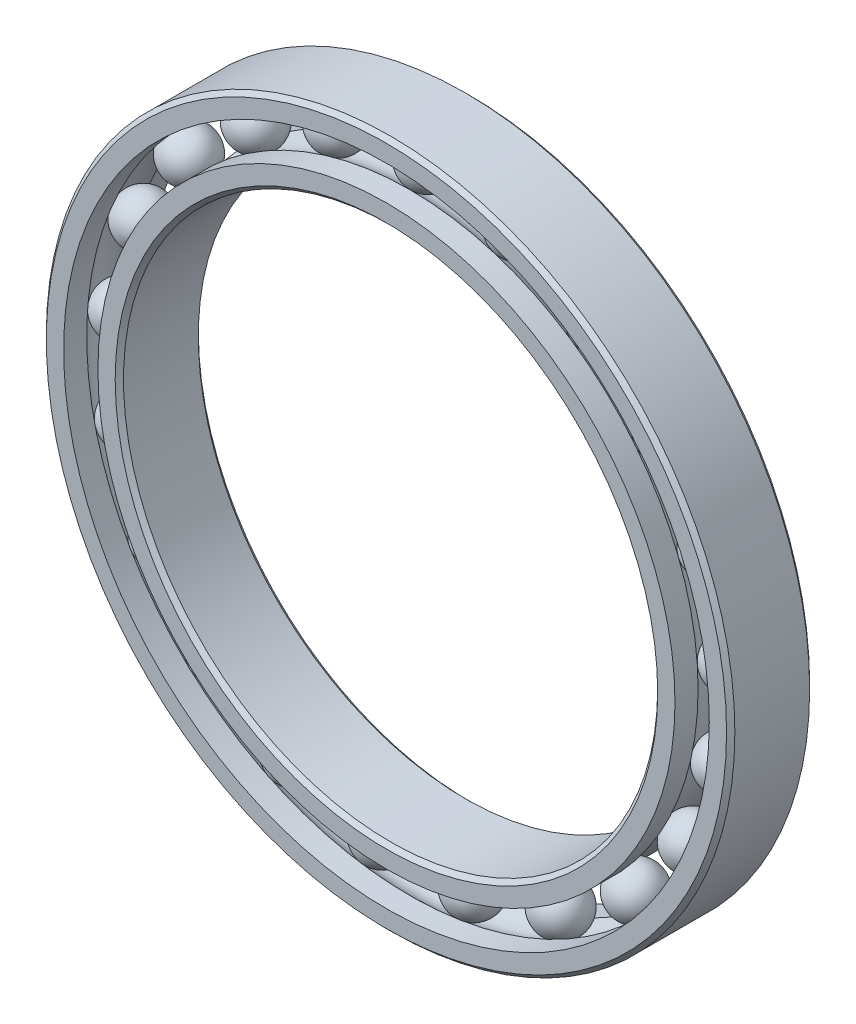
ISO-10303-21;
HEADER;
FILE_DESCRIPTION(('STEP AP214'),'2;1');
FILE_NAME('part.step','',(''),(''),'','','');
FILE_SCHEMA(('AUTOMOTIVE_DESIGN { 1 0 10303 214 1 1 1 1 }'));
ENDSEC;
DATA;
#1=APPLICATION_CONTEXT('core data for automotive mechanical design processes');
#2=APPLICATION_PROTOCOL_DEFINITION('international standard','automotive_design',2000,#1);
#3=PRODUCT_CONTEXT('',#1,'mechanical');
#4=PRODUCT('Part','Part','',(#3));
#5=PRODUCT_RELATED_PRODUCT_CATEGORY('part','',(#4));
#6=PRODUCT_DEFINITION_FORMATION('','',#4);
#7=PRODUCT_DEFINITION_CONTEXT('part definition',#1,'design');
#8=PRODUCT_DEFINITION('design','',#6,#7);
#9=PRODUCT_DEFINITION_SHAPE('','',#8);
#10=(LENGTH_UNIT() NAMED_UNIT(*) SI_UNIT(.MILLI.,.METRE.));
#11=(NAMED_UNIT(*) PLANE_ANGLE_UNIT() SI_UNIT($,.RADIAN.));
#12=(NAMED_UNIT(*) SI_UNIT($,.STERADIAN.) SOLID_ANGLE_UNIT());
#13=UNCERTAINTY_MEASURE_WITH_UNIT(LENGTH_MEASURE(1.E-05),#10,'distance_accuracy_value','');
#14=(GEOMETRIC_REPRESENTATION_CONTEXT(3) GLOBAL_UNCERTAINTY_ASSIGNED_CONTEXT((#13)) GLOBAL_UNIT_ASSIGNED_CONTEXT((#10,
#11,#12)) REPRESENTATION_CONTEXT('',''));
#15=CARTESIAN_POINT('',(0.,0.,0.));
#16=DIRECTION('',(0.,0.,1.));
#17=DIRECTION('',(1.,0.,0.));
#18=AXIS2_PLACEMENT_3D('',#15,#16,#17);
#19=CARTESIAN_POINT('',(7.58994574108045,24.6059997489932,0.));
#20=DIRECTION('',(0.,0.,1.));
#21=DIRECTION('',(0.294755174410891,0.955572805786145,0.));
#22=AXIS2_PLACEMENT_3D('',#19,#20,#21);
#23=SPHERICAL_SURFACE('',#22,2.12277479717142);
#24=CARTESIAN_POINT('',(7.58994574108045,24.6059997489932,2.12277479717142));
#25=VERTEX_POINT('',#24);
#26=VERTEX_LOOP('',#25);
#27=FACE_BOUND('',#26,.T.);
#28=ADVANCED_FACE('F37',(#27),#23,.T.);
#29=CLOSED_SHELL('',(#28));
#30=MANIFOLD_SOLID_BREP('B2',#29);
#31=CARTESIAN_POINT('',(14.505491495138,21.2756484386371,0.));
#32=DIRECTION('',(0.,0.,1.));
#33=DIRECTION('',(0.563320058063612,0.826238774316002,0.));
#34=AXIS2_PLACEMENT_3D('',#31,#32,#33);
#35=SPHERICAL_SURFACE('',#34,2.12277479717142);
#36=CARTESIAN_POINT('',(14.505491495138,21.2756484386371,2.12277479717142));
#37=VERTEX_POINT('',#36);
#38=VERTEX_LOOP('',#37);
#39=FACE_BOUND('',#38,.T.);
#40=ADVANCED_FACE('F55',(#39),#35,.T.);
#41=CLOSED_SHELL('',(#40));
#42=MANIFOLD_SOLID_BREP('B6',#41);
#43=CARTESIAN_POINT('',(20.1321606735516,16.0548623978626,0.));
#44=DIRECTION('',(0.,0.,1.));
#45=DIRECTION('',(0.781831482468022,0.623489801858743,0.));
#46=AXIS2_PLACEMENT_3D('',#43,#44,#45);
#47=SPHERICAL_SURFACE('',#46,2.12277479717142);
#48=CARTESIAN_POINT('',(20.1321606735516,16.0548623978626,2.12277479717142));
#49=VERTEX_POINT('',#48);
#50=VERTEX_LOOP('',#49);
#51=FACE_BOUND('',#50,.T.);
#52=ADVANCED_FACE('F73',(#51),#47,.T.);
#53=CLOSED_SHELL('',(#52));
#54=MANIFOLD_SOLID_BREP('B33',#53);
#55=CARTESIAN_POINT('',(23.9699990275882,9.40753137743494,0.));
#56=DIRECTION('',(0.,0.,1.));
#57=DIRECTION('',(0.9308737486442,0.365341024366405,0.));
#58=AXIS2_PLACEMENT_3D('',#55,#56,#57);
#59=SPHERICAL_SURFACE('',#58,2.12277479717142);
#60=CARTESIAN_POINT('',(23.9699990275882,9.40753137743494,2.12277479717142));
#61=VERTEX_POINT('',#60);
#62=VERTEX_LOOP('',#61);
#63=FACE_BOUND('',#62,.T.);
#64=ADVANCED_FACE('F91',(#63),#59,.T.);
#65=CLOSED_SHELL('',(#64));
#66=MANIFOLD_SOLID_BREP('B51',#65);
#67=CARTESIAN_POINT('',(25.6779977774154,1.9242999098507,0.));
#68=DIRECTION('',(0.,0.,1.));
#69=DIRECTION('',(0.997203797181179,0.074730093586435,0.));
#70=AXIS2_PLACEMENT_3D('',#67,#68,#69);
#71=SPHERICAL_SURFACE('',#70,2.12277479717142);
#72=CARTESIAN_POINT('',(25.6779977774154,1.9242999098507,2.12277479717142));
#73=VERTEX_POINT('',#72);
#74=VERTEX_LOOP('',#73);
#75=FACE_BOUND('',#74,.T.);
#76=ADVANCED_FACE('F111',(#75),#71,.T.);
#77=CLOSED_SHELL('',(#76));
#78=MANIFOLD_SOLID_BREP('B69',#77);
#79=CARTESIAN_POINT('',(25.104393738682,-5.72991404937483,0.));
#80=DIRECTION('',(0.,0.,1.));
#81=DIRECTION('',(0.974927912181826,-0.222520933956304,0.));
#82=AXIS2_PLACEMENT_3D('',#79,#80,#81);
#83=SPHERICAL_SURFACE('',#82,2.12277479717142);
#84=CARTESIAN_POINT('',(25.104393738682,-5.72991404937483,2.12277479717142));
#85=VERTEX_POINT('',#84);
#86=VERTEX_LOOP('',#85);
#87=FACE_BOUND('',#86,.T.);
#88=ADVANCED_FACE('F131',(#87),#83,.T.);
#89=CLOSED_SHELL('',(#88));
#90=MANIFOLD_SOLID_BREP('B87',#89);
#91=CARTESIAN_POINT('',(22.3001541474494,-12.8749999999998,0.));
#92=DIRECTION('',(0.,0.,1.));
#93=DIRECTION('',(0.866025403784443,-0.499999999999992,0.));
#94=AXIS2_PLACEMENT_3D('',#91,#92,#93);
#95=SPHERICAL_SURFACE('',#94,2.12277479717142);
#96=CARTESIAN_POINT('',(22.3001541474494,-12.8749999999998,2.12277479717142));
#97=VERTEX_POINT('',#96);
#98=VERTEX_LOOP('',#97);
#99=FACE_BOUND('',#98,.T.);
#100=ADVANCED_FACE('F151',(#99),#95,.T.);
#101=CLOSED_SHELL('',(#100));
#102=MANIFOLD_SOLID_BREP('B107',#101);
#103=CARTESIAN_POINT('',(17.5144479976013,-18.8760856996179,0.));
#104=DIRECTION('',(0.,0.,1.));
#105=DIRECTION('',(0.680172737770926,-0.73305187182982,0.));
#106=AXIS2_PLACEMENT_3D('',#103,#104,#105);
#107=SPHERICAL_SURFACE('',#106,2.12277479717142);
#108=CARTESIAN_POINT('',(17.5144479976013,-18.8760856996179,2.12277479717142));
#109=VERTEX_POINT('',#108);
#110=VERTEX_LOOP('',#109);
#111=FACE_BOUND('',#110,.T.);
#112=ADVANCED_FACE('F171',(#111),#107,.T.);
#113=CLOSED_SHELL('',(#112));
#114=MANIFOLD_SOLID_BREP('B127',#113);
#115=CARTESIAN_POINT('',(11.1725062822773,-23.1999483484872,0.));
#116=DIRECTION('',(0.,0.,1.));
#117=DIRECTION('',(0.433883739117565,-0.900968867902416,0.));
#118=AXIS2_PLACEMENT_3D('',#115,#116,#117);
#119=SPHERICAL_SURFACE('',#118,2.12277479717142);
#120=CARTESIAN_POINT('',(11.1725062822773,-23.1999483484872,2.12277479717142));
#121=VERTEX_POINT('',#120);
#122=VERTEX_LOOP('',#121);
#123=FACE_BOUND('',#122,.T.);
#124=ADVANCED_FACE('F191',(#123),#119,.T.);
#125=CLOSED_SHELL('',(#124));
#126=MANIFOLD_SOLID_BREP('B147',#125);
#127=CARTESIAN_POINT('',(3.83783835403668,-25.462393775297,0.));
#128=DIRECTION('',(0.,0.,1.));
#129=DIRECTION('',(0.149042266176182,-0.988830826225127,0.));
#130=AXIS2_PLACEMENT_3D('',#127,#128,#129);
#131=SPHERICAL_SURFACE('',#130,2.12277479717142);
#132=CARTESIAN_POINT('',(3.83783835403668,-25.462393775297,2.12277479717142));
#133=VERTEX_POINT('',#132);
#134=VERTEX_LOOP('',#133);
#135=FACE_BOUND('',#134,.T.);
#136=ADVANCED_FACE('F211',(#135),#131,.T.);
#137=CLOSED_SHELL('',(#136));
#138=MANIFOLD_SOLID_BREP('B167',#137);
#139=CARTESIAN_POINT('',(-3.83783835403632,-25.4623937752971,0.));
#140=DIRECTION('',(0.,0.,1.));
#141=DIRECTION('',(-0.149042266176168,-0.98883082622513,0.));
#142=AXIS2_PLACEMENT_3D('',#139,#140,#141);
#143=SPHERICAL_SURFACE('',#142,2.12277479717142);
#144=CARTESIAN_POINT('',(-3.83783835403632,-25.4623937752971,2.12277479717142));
#145=VERTEX_POINT('',#144);
#146=VERTEX_LOOP('',#145);
#147=FACE_BOUND('',#146,.T.);
#148=ADVANCED_FACE('F231',(#147),#143,.T.);
#149=CLOSED_SHELL('',(#148));
#150=MANIFOLD_SOLID_BREP('B187',#149);
#151=CARTESIAN_POINT('',(-11.172506282277,-23.1999483484874,0.));
#152=DIRECTION('',(0.,0.,1.));
#153=DIRECTION('',(-0.433883739117553,-0.900968867902422,0.));
#154=AXIS2_PLACEMENT_3D('',#151,#152,#153);
#155=SPHERICAL_SURFACE('',#154,2.12277479717142);
#156=CARTESIAN_POINT('',(-11.172506282277,-23.1999483484874,2.12277479717142));
#157=VERTEX_POINT('',#156);
#158=VERTEX_LOOP('',#157);
#159=FACE_BOUND('',#158,.T.);
#160=ADVANCED_FACE('F251',(#159),#155,.T.);
#161=CLOSED_SHELL('',(#160));
#162=MANIFOLD_SOLID_BREP('B207',#161);
#163=CARTESIAN_POINT('',(-17.5144479976011,-18.8760856996181,0.));
#164=DIRECTION('',(0.,0.,1.));
#165=DIRECTION('',(-0.680172737770915,-0.73305187182983,0.));
#166=AXIS2_PLACEMENT_3D('',#163,#164,#165);
#167=SPHERICAL_SURFACE('',#166,2.12277479717142);
#168=CARTESIAN_POINT('',(-17.5144479976011,-18.8760856996181,2.12277479717142));
#169=VERTEX_POINT('',#168);
#170=VERTEX_LOOP('',#169);
#171=FACE_BOUND('',#170,.T.);
#172=ADVANCED_FACE('F271',(#171),#167,.T.);
#173=CLOSED_SHELL('',(#172));
#174=MANIFOLD_SOLID_BREP('B227',#173);
#175=CARTESIAN_POINT('',(-22.3001541474492,-12.8750000000001,0.));
#176=DIRECTION('',(0.,0.,1.));
#177=DIRECTION('',(-0.866025403784436,-0.500000000000004,0.));
#178=AXIS2_PLACEMENT_3D('',#175,#176,#177);
#179=SPHERICAL_SURFACE('',#178,2.12277479717142);
#180=CARTESIAN_POINT('',(-22.3001541474492,-12.8750000000001,2.12277479717142));
#181=VERTEX_POINT('',#180);
#182=VERTEX_LOOP('',#181);
#183=FACE_BOUND('',#182,.T.);
#184=ADVANCED_FACE('F291',(#183),#179,.T.);
#185=CLOSED_SHELL('',(#184));
#186=MANIFOLD_SOLID_BREP('B247',#185);
#187=CARTESIAN_POINT('',(-25.1043937386819,-5.72991404937519,0.));
#188=DIRECTION('',(0.,0.,1.));
#189=DIRECTION('',(-0.974927912181823,-0.222520933956318,0.));
#190=AXIS2_PLACEMENT_3D('',#187,#188,#189);
#191=SPHERICAL_SURFACE('',#190,2.12277479717142);
#192=CARTESIAN_POINT('',(-25.1043937386819,-5.72991404937519,2.12277479717142));
#193=VERTEX_POINT('',#192);
#194=VERTEX_LOOP('',#193);
#195=FACE_BOUND('',#194,.T.);
#196=ADVANCED_FACE('F311',(#195),#191,.T.);
#197=CLOSED_SHELL('',(#196));
#198=MANIFOLD_SOLID_BREP('B267',#197);
#199=CARTESIAN_POINT('',(-25.6779977774154,1.92429990985034,0.));
#200=DIRECTION('',(0.,0.,1.));
#201=DIRECTION('',(-0.997203797181181,0.0747300935864209,0.));
#202=AXIS2_PLACEMENT_3D('',#199,#200,#201);
#203=SPHERICAL_SURFACE('',#202,2.12277479717142);
#204=CARTESIAN_POINT('',(-25.6779977774154,1.92429990985034,2.12277479717142));
#205=VERTEX_POINT('',#204);
#206=VERTEX_LOOP('',#205);
#207=FACE_BOUND('',#206,.T.);
#208=ADVANCED_FACE('F331',(#207),#203,.T.);
#209=CLOSED_SHELL('',(#208));
#210=MANIFOLD_SOLID_BREP('B287',#209);
#211=CARTESIAN_POINT('',(-23.9699990275883,9.40753137743461,0.));
#212=DIRECTION('',(0.,0.,1.));
#213=DIRECTION('',(-0.930873748644205,0.365341024366392,0.));
#214=AXIS2_PLACEMENT_3D('',#211,#212,#213);
#215=SPHERICAL_SURFACE('',#214,2.12277479717142);
#216=CARTESIAN_POINT('',(-23.9699990275883,9.40753137743461,2.12277479717142));
#217=VERTEX_POINT('',#216);
#218=VERTEX_LOOP('',#217);
#219=FACE_BOUND('',#218,.T.);
#220=ADVANCED_FACE('F351',(#219),#215,.T.);
#221=CLOSED_SHELL('',(#220));
#222=MANIFOLD_SOLID_BREP('B307',#221);
#223=CARTESIAN_POINT('',(-20.1321606735518,16.0548623978624,0.));
#224=DIRECTION('',(0.,0.,1.));
#225=DIRECTION('',(-0.781831482468031,0.623489801858732,0.));
#226=AXIS2_PLACEMENT_3D('',#223,#224,#225);
#227=SPHERICAL_SURFACE('',#226,2.12277479717142);
#228=CARTESIAN_POINT('',(-20.1321606735518,16.0548623978624,2.12277479717142));
#229=VERTEX_POINT('',#228);
#230=VERTEX_LOOP('',#229);
#231=FACE_BOUND('',#230,.T.);
#232=ADVANCED_FACE('F371',(#231),#227,.T.);
#233=CLOSED_SHELL('',(#232));
#234=MANIFOLD_SOLID_BREP('B327',#233);
#235=CARTESIAN_POINT('',(-14.5054914951383,21.2756484386368,0.));
#236=DIRECTION('',(0.,0.,1.));
#237=DIRECTION('',(-0.563320058063623,0.826238774315994,0.));
#238=AXIS2_PLACEMENT_3D('',#235,#236,#237);
#239=SPHERICAL_SURFACE('',#238,2.12277479717142);
#240=CARTESIAN_POINT('',(-14.5054914951383,21.2756484386368,2.12277479717142));
#241=VERTEX_POINT('',#240);
#242=VERTEX_LOOP('',#241);
#243=FACE_BOUND('',#242,.T.);
#244=ADVANCED_FACE('F391',(#243),#239,.T.);
#245=CLOSED_SHELL('',(#244));
#246=MANIFOLD_SOLID_BREP('B347',#245);
#247=CARTESIAN_POINT('',(-7.5899457410808,24.6059997489931,0.));
#248=DIRECTION('',(0.,0.,1.));
#249=DIRECTION('',(-0.294755174410905,0.955572805786141,0.));
#250=AXIS2_PLACEMENT_3D('',#247,#248,#249);
#251=SPHERICAL_SURFACE('',#250,2.12277479717142);
#252=CARTESIAN_POINT('',(-7.5899457410808,24.6059997489931,2.12277479717142));
#253=VERTEX_POINT('',#252);
#254=VERTEX_LOOP('',#253);
#255=FACE_BOUND('',#254,.T.);
#256=ADVANCED_FACE('F411',(#255),#251,.T.);
#257=CLOSED_SHELL('',(#256));
#258=MANIFOLD_SOLID_BREP('B367',#257);
#259=CARTESIAN_POINT('',(0.,25.75,0.));
#260=DIRECTION('',(0.,0.,1.));
#261=DIRECTION('',(0.,1.,0.));
#262=AXIS2_PLACEMENT_3D('',#259,#260,#261);
#263=SPHERICAL_SURFACE('',#262,2.12277479717142);
#264=CARTESIAN_POINT('',(0.,25.75,2.12277479717142));
#265=VERTEX_POINT('',#264);
#266=VERTEX_LOOP('',#265);
#267=FACE_BOUND('',#266,.T.);
#268=ADVANCED_FACE('F433',(#267),#263,.T.);
#269=CLOSED_SHELL('',(#268));
#270=MANIFOLD_SOLID_BREP('B387',#269);
#271=CARTESIAN_POINT('',(0.,24.3055555555556,3.5));
#272=DIRECTION('',(0.,0.,-1.));
#273=DIRECTION('',(-1.,0.,0.));
#274=AXIS2_PLACEMENT_3D('',#271,#272,#273);
#275=PLANE('',#274);
#276=CARTESIAN_POINT('',(0.,0.,3.5));
#277=DIRECTION('',(0.,0.,1.));
#278=DIRECTION('',(1.,0.,0.));
#279=AXIS2_PLACEMENT_3D('',#276,#277,#278);
#280=CIRCLE('',#279,22.85);
#281=CARTESIAN_POINT('',(22.85,0.,3.5));
#282=VERTEX_POINT('',#281);
#283=EDGE_CURVE('E480',#282,#282,#280,.T.);
#284=ORIENTED_EDGE('',*,*,#283,.F.);
#285=EDGE_LOOP('',(#284));
#286=FACE_BOUND('',#285,.T.);
#287=CARTESIAN_POINT('',(0.,0.,3.5));
#288=DIRECTION('',(0.,0.,1.));
#289=DIRECTION('',(1.,0.,0.));
#290=AXIS2_PLACEMENT_3D('',#287,#288,#289);
#291=CIRCLE('',#290,24.3055555555556);
#292=CARTESIAN_POINT('',(24.3055555555556,0.,3.5));
#293=VERTEX_POINT('',#292);
#294=EDGE_CURVE('E432',#293,#293,#291,.T.);
#295=ORIENTED_EDGE('',*,*,#294,.T.);
#296=EDGE_LOOP('',(#295));
#297=FACE_BOUND('',#296,.T.);
#298=ADVANCED_FACE('F452',(#286,#297),#275,.F.);
#299=CARTESIAN_POINT('',(0.,0.,3.5));
#300=DIRECTION('',(0.,0.,1.));
#301=DIRECTION('',(1.,0.,0.));
#302=AXIS2_PLACEMENT_3D('',#299,#300,#301);
#303=CYLINDRICAL_SURFACE('',#302,24.3055555555556);
#304=ORIENTED_EDGE('',*,*,#294,.F.);
#305=EDGE_LOOP('',(#304));
#306=FACE_BOUND('',#305,.T.);
#307=CARTESIAN_POINT('',(0.,0.,1.55555555555556));
#308=DIRECTION('',(0.,0.,1.));
#309=DIRECTION('',(1.,0.,0.));
#310=AXIS2_PLACEMENT_3D('',#307,#308,#309);
#311=CIRCLE('',#310,24.3055555555556);
#312=CARTESIAN_POINT('',(24.3055555555556,0.,1.55555555555556));
#313=VERTEX_POINT('',#312);
#314=EDGE_CURVE('E458',#313,#313,#311,.T.);
#315=ORIENTED_EDGE('',*,*,#314,.T.);
#316=EDGE_LOOP('',(#315));
#317=FACE_BOUND('',#316,.T.);
#318=ADVANCED_FACE('F487',(#306,#317),#303,.T.);
#319=CARTESIAN_POINT('',(0.,0.,0.));
#320=DIRECTION('',(0.,0.,1.));
#321=DIRECTION('',(1.,0.,0.));
#322=AXIS2_PLACEMENT_3D('',#319,#320,#321);
#323=TOROIDAL_SURFACE('',#322,25.75,2.12277479717142);
#324=ORIENTED_EDGE('',*,*,#314,.F.);
#325=EDGE_LOOP('',(#324));
#326=FACE_BOUND('',#325,.T.);
#327=CARTESIAN_POINT('',(0.,0.,-1.55555555555556));
#328=DIRECTION('',(0.,0.,1.));
#329=DIRECTION('',(1.,0.,0.));
#330=AXIS2_PLACEMENT_3D('',#327,#328,#329);
#331=CIRCLE('',#330,24.3055555555556);
#332=CARTESIAN_POINT('',(24.3055555555556,0.,-1.55555555555556));
#333=VERTEX_POINT('',#332);
#334=EDGE_CURVE('E462',#333,#333,#331,.T.);
#335=ORIENTED_EDGE('',*,*,#334,.T.);
#336=EDGE_LOOP('',(#335));
#337=FACE_BOUND('',#336,.T.);
#338=ADVANCED_FACE('F491',(#326,#337),#323,.F.);
#339=CARTESIAN_POINT('',(0.,0.,3.5));
#340=DIRECTION('',(0.,0.,1.));
#341=DIRECTION('',(1.,0.,0.));
#342=AXIS2_PLACEMENT_3D('',#339,#340,#341);
#343=CYLINDRICAL_SURFACE('',#342,24.3055555555556);
#344=ORIENTED_EDGE('',*,*,#334,.F.);
#345=EDGE_LOOP('',(#344));
#346=FACE_BOUND('',#345,.T.);
#347=CARTESIAN_POINT('',(0.,0.,-3.5));
#348=DIRECTION('',(0.,0.,1.));
#349=DIRECTION('',(1.,0.,0.));
#350=AXIS2_PLACEMENT_3D('',#347,#348,#349);
#351=CIRCLE('',#350,24.3055555555556);
#352=CARTESIAN_POINT('',(24.3055555555556,0.,-3.5));
#353=VERTEX_POINT('',#352);
#354=EDGE_CURVE('E466',#353,#353,#351,.T.);
#355=ORIENTED_EDGE('',*,*,#354,.T.);
#356=EDGE_LOOP('',(#355));
#357=FACE_BOUND('',#356,.T.);
#358=ADVANCED_FACE('F496',(#346,#357),#343,.T.);
#359=CARTESIAN_POINT('',(0.,22.85,-3.5));
#360=DIRECTION('',(0.,0.,1.));
#361=DIRECTION('',(1.,0.,0.));
#362=AXIS2_PLACEMENT_3D('',#359,#360,#361);
#363=PLANE('',#362);
#364=ORIENTED_EDGE('',*,*,#354,.F.);
#365=EDGE_LOOP('',(#364));
#366=FACE_BOUND('',#365,.T.);
#367=CARTESIAN_POINT('',(0.,0.,-3.5));
#368=DIRECTION('',(0.,0.,1.));
#369=DIRECTION('',(1.,0.,0.));
#370=AXIS2_PLACEMENT_3D('',#367,#368,#369);
#371=CIRCLE('',#370,22.85);
#372=CARTESIAN_POINT('',(22.85,0.,-3.5));
#373=VERTEX_POINT('',#372);
#374=EDGE_CURVE('E471',#373,#373,#371,.T.);
#375=ORIENTED_EDGE('',*,*,#374,.T.);
#376=EDGE_LOOP('',(#375));
#377=FACE_BOUND('',#376,.T.);
#378=ADVANCED_FACE('F502',(#366,#377),#363,.F.);
#379=CARTESIAN_POINT('',(0.,0.,-3.15));
#380=DIRECTION('',(0.,0.,-1.));
#381=DIRECTION('',(-1.,0.,0.));
#382=AXIS2_PLACEMENT_3D('',#379,#380,#381);
#383=CONICAL_SURFACE('',#382,22.5,0.785398163397446);
#384=ORIENTED_EDGE('',*,*,#374,.F.);
#385=EDGE_LOOP('',(#384));
#386=FACE_BOUND('',#385,.T.);
#387=CARTESIAN_POINT('',(0.,0.,-3.15));
#388=DIRECTION('',(0.,0.,1.));
#389=DIRECTION('',(1.,0.,0.));
#390=AXIS2_PLACEMENT_3D('',#387,#388,#389);
#391=CIRCLE('',#390,22.5);
#392=CARTESIAN_POINT('',(22.5,0.,-3.15));
#393=VERTEX_POINT('',#392);
#394=EDGE_CURVE('E474',#393,#393,#391,.T.);
#395=ORIENTED_EDGE('',*,*,#394,.T.);
#396=EDGE_LOOP('',(#395));
#397=FACE_BOUND('',#396,.T.);
#398=ADVANCED_FACE('F506',(#386,#397),#383,.F.);
#399=CARTESIAN_POINT('',(0.,0.,3.5));
#400=DIRECTION('',(0.,0.,1.));
#401=DIRECTION('',(1.,0.,0.));
#402=AXIS2_PLACEMENT_3D('',#399,#400,#401);
#403=CYLINDRICAL_SURFACE('',#402,22.5);
#404=ORIENTED_EDGE('',*,*,#394,.F.);
#405=EDGE_LOOP('',(#404));
#406=FACE_BOUND('',#405,.T.);
#407=CARTESIAN_POINT('',(0.,0.,3.15));
#408=DIRECTION('',(0.,0.,1.));
#409=DIRECTION('',(1.,0.,0.));
#410=AXIS2_PLACEMENT_3D('',#407,#408,#409);
#411=CIRCLE('',#410,22.5);
#412=CARTESIAN_POINT('',(22.5,0.,3.15));
#413=VERTEX_POINT('',#412);
#414=EDGE_CURVE('E477',#413,#413,#411,.T.);
#415=ORIENTED_EDGE('',*,*,#414,.T.);
#416=EDGE_LOOP('',(#415));
#417=FACE_BOUND('',#416,.T.);
#418=ADVANCED_FACE('F510',(#406,#417),#403,.F.);
#419=CARTESIAN_POINT('',(0.,0.,3.5));
#420=DIRECTION('',(0.,0.,1.));
#421=DIRECTION('',(1.,0.,0.));
#422=AXIS2_PLACEMENT_3D('',#419,#420,#421);
#423=CONICAL_SURFACE('',#422,22.85,0.785398163397449);
#424=ORIENTED_EDGE('',*,*,#414,.F.);
#425=EDGE_LOOP('',(#424));
#426=FACE_BOUND('',#425,.T.);
#427=ORIENTED_EDGE('',*,*,#283,.T.);
#428=EDGE_LOOP('',(#427));
#429=FACE_BOUND('',#428,.T.);
#430=ADVANCED_FACE('F484',(#426,#429),#423,.F.);
#431=CLOSED_SHELL('',(#298,#318,#338,#358,#378,#398,#418,#430));
#432=MANIFOLD_SOLID_BREP('B407',#431);
#433=CARTESIAN_POINT('',(0.,0.,3.15));
#434=DIRECTION('',(0.,0.,-1.));
#435=DIRECTION('',(-1.,0.,0.));
#436=AXIS2_PLACEMENT_3D('',#433,#434,#435);
#437=CONICAL_SURFACE('',#436,29.,0.785398163397445);
#438=CARTESIAN_POINT('',(0.,0.,3.5));
#439=DIRECTION('',(0.,0.,1.));
#440=DIRECTION('',(1.,0.,0.));
#441=AXIS2_PLACEMENT_3D('',#438,#439,#440);
#442=CIRCLE('',#441,28.65);
#443=CARTESIAN_POINT('',(28.65,0.,3.5));
#444=VERTEX_POINT('',#443);
#445=EDGE_CURVE('E601',#444,#444,#442,.T.);
#446=ORIENTED_EDGE('',*,*,#445,.F.);
#447=EDGE_LOOP('',(#446));
#448=FACE_BOUND('',#447,.T.);
#449=CARTESIAN_POINT('',(0.,0.,3.15));
#450=DIRECTION('',(0.,0.,1.));
#451=DIRECTION('',(1.,0.,0.));
#452=AXIS2_PLACEMENT_3D('',#449,#450,#451);
#453=CIRCLE('',#452,29.);
#454=CARTESIAN_POINT('',(29.,0.,3.15));
#455=VERTEX_POINT('',#454);
#456=EDGE_CURVE('E451',#455,#455,#453,.T.);
#457=ORIENTED_EDGE('',*,*,#456,.T.);
#458=EDGE_LOOP('',(#457));
#459=FACE_BOUND('',#458,.T.);
#460=ADVANCED_FACE('F573',(#448,#459),#437,.T.);
#461=CARTESIAN_POINT('',(0.,0.,3.5));
#462=DIRECTION('',(0.,0.,1.));
#463=DIRECTION('',(1.,0.,0.));
#464=AXIS2_PLACEMENT_3D('',#461,#462,#463);
#465=CYLINDRICAL_SURFACE('',#464,29.);
#466=ORIENTED_EDGE('',*,*,#456,.F.);
#467=EDGE_LOOP('',(#466));
#468=FACE_BOUND('',#467,.T.);
#469=CARTESIAN_POINT('',(0.,0.,-3.15));
#470=DIRECTION('',(0.,0.,1.));
#471=DIRECTION('',(1.,0.,0.));
#472=AXIS2_PLACEMENT_3D('',#469,#470,#471);
#473=CIRCLE('',#472,29.);
#474=CARTESIAN_POINT('',(29.,0.,-3.15));
#475=VERTEX_POINT('',#474);
#476=EDGE_CURVE('E579',#475,#475,#473,.T.);
#477=ORIENTED_EDGE('',*,*,#476,.T.);
#478=EDGE_LOOP('',(#477));
#479=FACE_BOUND('',#478,.T.);
#480=ADVANCED_FACE('F608',(#468,#479),#465,.T.);
#481=CARTESIAN_POINT('',(0.,0.,-3.5));
#482=DIRECTION('',(0.,0.,1.));
#483=DIRECTION('',(1.,0.,0.));
#484=AXIS2_PLACEMENT_3D('',#481,#482,#483);
#485=CONICAL_SURFACE('',#484,28.65,0.785398163397445);
#486=ORIENTED_EDGE('',*,*,#476,.F.);
#487=EDGE_LOOP('',(#486));
#488=FACE_BOUND('',#487,.T.);
#489=CARTESIAN_POINT('',(0.,0.,-3.5));
#490=DIRECTION('',(0.,0.,1.));
#491=DIRECTION('',(1.,0.,0.));
#492=AXIS2_PLACEMENT_3D('',#489,#490,#491);
#493=CIRCLE('',#492,28.65);
#494=CARTESIAN_POINT('',(28.65,0.,-3.5));
#495=VERTEX_POINT('',#494);
#496=EDGE_CURVE('E583',#495,#495,#493,.T.);
#497=ORIENTED_EDGE('',*,*,#496,.T.);
#498=EDGE_LOOP('',(#497));
#499=FACE_BOUND('',#498,.T.);
#500=ADVANCED_FACE('F612',(#488,#499),#485,.T.);
#501=CARTESIAN_POINT('',(0.,28.65,-3.5));
#502=DIRECTION('',(0.,0.,1.));
#503=DIRECTION('',(1.,0.,0.));
#504=AXIS2_PLACEMENT_3D('',#501,#502,#503);
#505=PLANE('',#504);
#506=ORIENTED_EDGE('',*,*,#496,.F.);
#507=EDGE_LOOP('',(#506));
#508=FACE_BOUND('',#507,.T.);
#509=CARTESIAN_POINT('',(0.,0.,-3.5));
#510=DIRECTION('',(0.,0.,1.));
#511=DIRECTION('',(1.,0.,0.));
#512=AXIS2_PLACEMENT_3D('',#509,#510,#511);
#513=CIRCLE('',#512,27.1944444444444);
#514=CARTESIAN_POINT('',(27.1944444444444,0.,-3.5));
#515=VERTEX_POINT('',#514);
#516=EDGE_CURVE('E587',#515,#515,#513,.T.);
#517=ORIENTED_EDGE('',*,*,#516,.T.);
#518=EDGE_LOOP('',(#517));
#519=FACE_BOUND('',#518,.T.);
#520=ADVANCED_FACE('F617',(#508,#519),#505,.F.);
#521=CARTESIAN_POINT('',(0.,0.,3.5));
#522=DIRECTION('',(0.,0.,1.));
#523=DIRECTION('',(1.,0.,0.));
#524=AXIS2_PLACEMENT_3D('',#521,#522,#523);
#525=CYLINDRICAL_SURFACE('',#524,27.1944444444444);
#526=ORIENTED_EDGE('',*,*,#516,.F.);
#527=EDGE_LOOP('',(#526));
#528=FACE_BOUND('',#527,.T.);
#529=CARTESIAN_POINT('',(0.,0.,-1.55555555555555));
#530=DIRECTION('',(0.,0.,1.));
#531=DIRECTION('',(1.,0.,0.));
#532=AXIS2_PLACEMENT_3D('',#529,#530,#531);
#533=CIRCLE('',#532,27.1944444444444);
#534=CARTESIAN_POINT('',(27.1944444444444,0.,-1.55555555555555));
#535=VERTEX_POINT('',#534);
#536=EDGE_CURVE('E592',#535,#535,#533,.T.);
#537=ORIENTED_EDGE('',*,*,#536,.T.);
#538=EDGE_LOOP('',(#537));
#539=FACE_BOUND('',#538,.T.);
#540=ADVANCED_FACE('F623',(#528,#539),#525,.F.);
#541=CARTESIAN_POINT('',(0.,0.,0.));
#542=DIRECTION('',(0.,0.,1.));
#543=DIRECTION('',(1.,0.,0.));
#544=AXIS2_PLACEMENT_3D('',#541,#542,#543);
#545=TOROIDAL_SURFACE('',#544,25.75,2.12277479717142);
#546=ORIENTED_EDGE('',*,*,#536,.F.);
#547=EDGE_LOOP('',(#546));
#548=FACE_BOUND('',#547,.T.);
#549=CARTESIAN_POINT('',(0.,0.,1.55555555555556));
#550=DIRECTION('',(0.,0.,1.));
#551=DIRECTION('',(1.,0.,0.));
#552=AXIS2_PLACEMENT_3D('',#549,#550,#551);
#553=CIRCLE('',#552,27.1944444444444);
#554=CARTESIAN_POINT('',(27.1944444444444,0.,1.55555555555556));
#555=VERTEX_POINT('',#554);
#556=EDGE_CURVE('E595',#555,#555,#553,.T.);
#557=ORIENTED_EDGE('',*,*,#556,.T.);
#558=EDGE_LOOP('',(#557));
#559=FACE_BOUND('',#558,.T.);
#560=ADVANCED_FACE('F627',(#548,#559),#545,.F.);
#561=CARTESIAN_POINT('',(0.,0.,3.5));
#562=DIRECTION('',(0.,0.,1.));
#563=DIRECTION('',(1.,0.,0.));
#564=AXIS2_PLACEMENT_3D('',#561,#562,#563);
#565=CYLINDRICAL_SURFACE('',#564,27.1944444444444);
#566=ORIENTED_EDGE('',*,*,#556,.F.);
#567=EDGE_LOOP('',(#566));
#568=FACE_BOUND('',#567,.T.);
#569=CARTESIAN_POINT('',(0.,0.,3.5));
#570=DIRECTION('',(0.,0.,1.));
#571=DIRECTION('',(1.,0.,0.));
#572=AXIS2_PLACEMENT_3D('',#569,#570,#571);
#573=CIRCLE('',#572,27.1944444444444);
#574=CARTESIAN_POINT('',(27.1944444444444,0.,3.5));
#575=VERTEX_POINT('',#574);
#576=EDGE_CURVE('E598',#575,#575,#573,.T.);
#577=ORIENTED_EDGE('',*,*,#576,.T.);
#578=EDGE_LOOP('',(#577));
#579=FACE_BOUND('',#578,.T.);
#580=ADVANCED_FACE('F631',(#568,#579),#565,.F.);
#581=CARTESIAN_POINT('',(0.,28.65,3.5));
#582=DIRECTION('',(0.,0.,-1.));
#583=DIRECTION('',(-1.,0.,0.));
#584=AXIS2_PLACEMENT_3D('',#581,#582,#583);
#585=PLANE('',#584);
#586=ORIENTED_EDGE('',*,*,#576,.F.);
#587=EDGE_LOOP('',(#586));
#588=FACE_BOUND('',#587,.T.);
#589=ORIENTED_EDGE('',*,*,#445,.T.);
#590=EDGE_LOOP('',(#589));
#591=FACE_BOUND('',#590,.T.);
#592=ADVANCED_FACE('F605',(#588,#591),#585,.F.);
#593=CLOSED_SHELL('',(#460,#480,#500,#520,#540,#560,#580,#592));
#594=MANIFOLD_SOLID_BREP('B427',#593);
#595=ADVANCED_BREP_SHAPE_REPRESENTATION('',(#18,#30,#42,#54,#66,#78,#90,#102,#114,#126,#138,
#150,#162,#174,#186,#198,#210,#222,#234,#246,#258,#270,#432,#594),#14);
#596=SHAPE_DEFINITION_REPRESENTATION(#9,#595);
ENDSEC;
END-ISO-10303-21;
